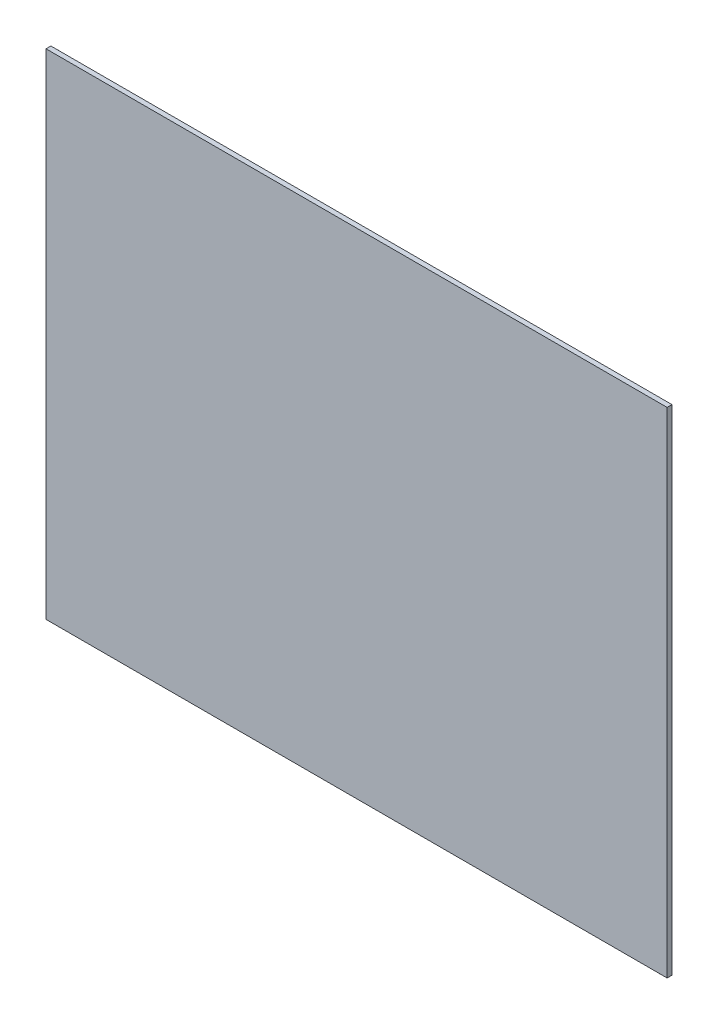
ISO-10303-21;
HEADER;
FILE_DESCRIPTION(('STEP AP214'),'2;1');
FILE_NAME('part.step','',(''),(''),'','','');
FILE_SCHEMA(('AUTOMOTIVE_DESIGN { 1 0 10303 214 1 1 1 1 }'));
ENDSEC;
DATA;
#1=APPLICATION_CONTEXT('core data for automotive mechanical design processes');
#2=APPLICATION_PROTOCOL_DEFINITION('international standard','automotive_design',2000,#1);
#3=PRODUCT_CONTEXT('',#1,'mechanical');
#4=PRODUCT('Part','Part','',(#3));
#5=PRODUCT_RELATED_PRODUCT_CATEGORY('part','',(#4));
#6=PRODUCT_DEFINITION_FORMATION('','',#4);
#7=PRODUCT_DEFINITION_CONTEXT('part definition',#1,'design');
#8=PRODUCT_DEFINITION('design','',#6,#7);
#9=PRODUCT_DEFINITION_SHAPE('','',#8);
#10=(LENGTH_UNIT() NAMED_UNIT(*) SI_UNIT(.MILLI.,.METRE.));
#11=(NAMED_UNIT(*) PLANE_ANGLE_UNIT() SI_UNIT($,.RADIAN.));
#12=(NAMED_UNIT(*) SI_UNIT($,.STERADIAN.) SOLID_ANGLE_UNIT());
#13=UNCERTAINTY_MEASURE_WITH_UNIT(LENGTH_MEASURE(1.E-05),#10,'distance_accuracy_value','');
#14=(GEOMETRIC_REPRESENTATION_CONTEXT(3) GLOBAL_UNCERTAINTY_ASSIGNED_CONTEXT((#13)) GLOBAL_UNIT_ASSIGNED_CONTEXT((#10,
#11,#12)) REPRESENTATION_CONTEXT('',''));
#15=CARTESIAN_POINT('',(0.,0.,0.));
#16=DIRECTION('',(0.,0.,1.));
#17=DIRECTION('',(1.,0.,0.));
#18=AXIS2_PLACEMENT_3D('',#15,#16,#17);
#19=CARTESIAN_POINT('',(416.,-331.,6.5));
#20=DIRECTION('',(-1.,0.,0.));
#21=DIRECTION('',(0.,0.,1.));
#22=AXIS2_PLACEMENT_3D('',#19,#20,#21);
#23=PLANE('',#22);
#24=DIRECTION('',(0.,1.,0.));
#25=VECTOR('',#24,1.);
#26=CARTESIAN_POINT('',(416.,-331.,0.));
#27=LINE('',#26,#25);
#28=CARTESIAN_POINT('',(416.,-331.,0.));
#29=VERTEX_POINT('',#28);
#30=CARTESIAN_POINT('',(416.,331.,0.));
#31=VERTEX_POINT('',#30);
#32=EDGE_CURVE('E95',#29,#31,#27,.T.);
#33=ORIENTED_EDGE('',*,*,#32,.T.);
#34=DIRECTION('',(0.,0.,-1.));
#35=VECTOR('',#34,1.);
#36=CARTESIAN_POINT('',(416.,331.,6.5));
#37=LINE('',#36,#35);
#38=CARTESIAN_POINT('',(416.,331.,6.5));
#39=VERTEX_POINT('',#38);
#40=EDGE_CURVE('E11',#39,#31,#37,.T.);
#41=ORIENTED_EDGE('',*,*,#40,.F.);
#42=DIRECTION('',(0.,1.,0.));
#43=VECTOR('',#42,1.);
#44=CARTESIAN_POINT('',(416.,-331.,6.5));
#45=LINE('',#44,#43);
#46=CARTESIAN_POINT('',(416.,-331.,6.5));
#47=VERTEX_POINT('',#46);
#48=EDGE_CURVE('E83',#47,#39,#45,.T.);
#49=ORIENTED_EDGE('',*,*,#48,.F.);
#50=DIRECTION('',(0.,0.,-1.));
#51=VECTOR('',#50,1.);
#52=CARTESIAN_POINT('',(416.,-331.,6.5));
#53=LINE('',#52,#51);
#54=EDGE_CURVE('E91',#47,#29,#53,.T.);
#55=ORIENTED_EDGE('',*,*,#54,.T.);
#56=EDGE_LOOP('',(#33,#41,#49,#55));
#57=FACE_BOUND('',#56,.T.);
#58=ADVANCED_FACE('F32',(#57),#23,.F.);
#59=CARTESIAN_POINT('',(-416.,331.,6.5));
#60=DIRECTION('',(0.,-1.,0.));
#61=DIRECTION('',(0.,0.,-1.));
#62=AXIS2_PLACEMENT_3D('',#59,#60,#61);
#63=PLANE('',#62);
#64=DIRECTION('',(-1.,0.,0.));
#65=VECTOR('',#64,1.);
#66=CARTESIAN_POINT('',(-416.,331.,0.));
#67=LINE('',#66,#65);
#68=CARTESIAN_POINT('',(-416.,331.,0.));
#69=VERTEX_POINT('',#68);
#70=EDGE_CURVE('E87',#31,#69,#67,.T.);
#71=ORIENTED_EDGE('',*,*,#70,.T.);
#72=DIRECTION('',(0.,0.,-1.));
#73=VECTOR('',#72,1.);
#74=CARTESIAN_POINT('',(-416.,331.,6.5));
#75=LINE('',#74,#73);
#76=CARTESIAN_POINT('',(-416.,331.,6.5));
#77=VERTEX_POINT('',#76);
#78=EDGE_CURVE('E40',#77,#69,#75,.T.);
#79=ORIENTED_EDGE('',*,*,#78,.F.);
#80=DIRECTION('',(-1.,0.,0.));
#81=VECTOR('',#80,1.);
#82=CARTESIAN_POINT('',(-416.,331.,6.5));
#83=LINE('',#82,#81);
#84=EDGE_CURVE('E78',#39,#77,#83,.T.);
#85=ORIENTED_EDGE('',*,*,#84,.F.);
#86=ORIENTED_EDGE('',*,*,#40,.T.);
#87=EDGE_LOOP('',(#71,#79,#85,#86));
#88=FACE_BOUND('',#87,.T.);
#89=ADVANCED_FACE('F86',(#88),#63,.F.);
#90=CARTESIAN_POINT('',(-416.,-331.,6.5));
#91=DIRECTION('',(1.,0.,0.));
#92=DIRECTION('',(0.,0.,-1.));
#93=AXIS2_PLACEMENT_3D('',#90,#91,#92);
#94=PLANE('',#93);
#95=DIRECTION('',(0.,-1.,0.));
#96=VECTOR('',#95,1.);
#97=CARTESIAN_POINT('',(-416.,-331.,0.));
#98=LINE('',#97,#96);
#99=CARTESIAN_POINT('',(-416.,-331.,0.));
#100=VERTEX_POINT('',#99);
#101=EDGE_CURVE('E65',#69,#100,#98,.T.);
#102=ORIENTED_EDGE('',*,*,#101,.T.);
#103=DIRECTION('',(0.,0.,-1.));
#104=VECTOR('',#103,1.);
#105=CARTESIAN_POINT('',(-416.,-331.,6.5));
#106=LINE('',#105,#104);
#107=CARTESIAN_POINT('',(-416.,-331.,6.5));
#108=VERTEX_POINT('',#107);
#109=EDGE_CURVE('E88',#108,#100,#106,.T.);
#110=ORIENTED_EDGE('',*,*,#109,.F.);
#111=DIRECTION('',(0.,-1.,0.));
#112=VECTOR('',#111,1.);
#113=CARTESIAN_POINT('',(-416.,-331.,6.5));
#114=LINE('',#113,#112);
#115=EDGE_CURVE('E81',#77,#108,#114,.T.);
#116=ORIENTED_EDGE('',*,*,#115,.F.);
#117=ORIENTED_EDGE('',*,*,#78,.T.);
#118=EDGE_LOOP('',(#102,#110,#116,#117));
#119=FACE_BOUND('',#118,.T.);
#120=ADVANCED_FACE('F89',(#119),#94,.F.);
#121=CARTESIAN_POINT('',(-416.,-331.,6.5));
#122=DIRECTION('',(0.,1.,0.));
#123=DIRECTION('',(0.,0.,1.));
#124=AXIS2_PLACEMENT_3D('',#121,#122,#123);
#125=PLANE('',#124);
#126=DIRECTION('',(1.,0.,0.));
#127=VECTOR('',#126,1.);
#128=CARTESIAN_POINT('',(-416.,-331.,0.));
#129=LINE('',#128,#127);
#130=EDGE_CURVE('E71',#100,#29,#129,.T.);
#131=ORIENTED_EDGE('',*,*,#130,.T.);
#132=ORIENTED_EDGE('',*,*,#54,.F.);
#133=DIRECTION('',(1.,0.,0.));
#134=VECTOR('',#133,1.);
#135=CARTESIAN_POINT('',(-416.,-331.,6.5));
#136=LINE('',#135,#134);
#137=EDGE_CURVE('E48',#108,#47,#136,.T.);
#138=ORIENTED_EDGE('',*,*,#137,.F.);
#139=ORIENTED_EDGE('',*,*,#109,.T.);
#140=EDGE_LOOP('',(#131,#132,#138,#139));
#141=FACE_BOUND('',#140,.T.);
#142=ADVANCED_FACE('F102',(#141),#125,.F.);
#143=CARTESIAN_POINT('',(0.,0.,6.5));
#144=DIRECTION('',(0.,0.,-1.));
#145=DIRECTION('',(-1.,0.,0.));
#146=AXIS2_PLACEMENT_3D('',#143,#144,#145);
#147=PLANE('',#146);
#148=ORIENTED_EDGE('',*,*,#48,.T.);
#149=ORIENTED_EDGE('',*,*,#84,.T.);
#150=ORIENTED_EDGE('',*,*,#115,.T.);
#151=ORIENTED_EDGE('',*,*,#137,.T.);
#152=EDGE_LOOP('',(#148,#149,#150,#151));
#153=FACE_BOUND('',#152,.T.);
#154=ADVANCED_FACE('F79',(#153),#147,.F.);
#155=CARTESIAN_POINT('',(0.,0.,0.));
#156=DIRECTION('',(0.,0.,-1.));
#157=DIRECTION('',(-1.,0.,0.));
#158=AXIS2_PLACEMENT_3D('',#155,#156,#157);
#159=PLANE('',#158);
#160=ORIENTED_EDGE('',*,*,#32,.F.);
#161=ORIENTED_EDGE('',*,*,#130,.F.);
#162=ORIENTED_EDGE('',*,*,#101,.F.);
#163=ORIENTED_EDGE('',*,*,#70,.F.);
#164=EDGE_LOOP('',(#160,#161,#162,#163));
#165=FACE_BOUND('',#164,.T.);
#166=ADVANCED_FACE('F105',(#165),#159,.T.);
#167=CLOSED_SHELL('',(#58,#89,#120,#142,#154,#166));
#168=MANIFOLD_SOLID_BREP('B2',#167);
#169=ADVANCED_BREP_SHAPE_REPRESENTATION('',(#18,#168),#14);
#170=SHAPE_DEFINITION_REPRESENTATION(#9,#169);
ENDSEC;
END-ISO-10303-21;
